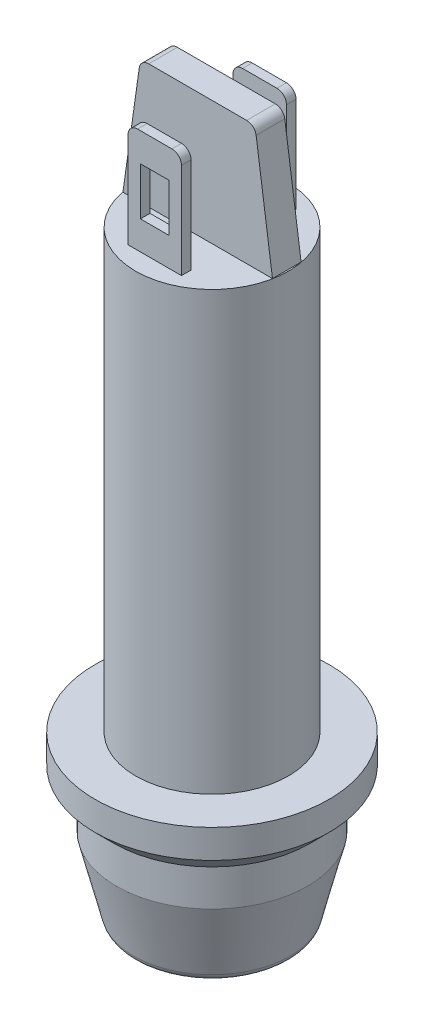
ISO-10303-21;
HEADER;
FILE_DESCRIPTION(('STEP AP214'),'2;1');
FILE_NAME('part.step','',(''),(''),'','','');
FILE_SCHEMA(('AUTOMOTIVE_DESIGN { 1 0 10303 214 1 1 1 1 }'));
ENDSEC;
DATA;
#1=APPLICATION_CONTEXT('core data for automotive mechanical design processes');
#2=APPLICATION_PROTOCOL_DEFINITION('international standard','automotive_design',2000,#1);
#3=PRODUCT_CONTEXT('',#1,'mechanical');
#4=PRODUCT('Part','Part','',(#3));
#5=PRODUCT_RELATED_PRODUCT_CATEGORY('part','',(#4));
#6=PRODUCT_DEFINITION_FORMATION('','',#4);
#7=PRODUCT_DEFINITION_CONTEXT('part definition',#1,'design');
#8=PRODUCT_DEFINITION('design','',#6,#7);
#9=PRODUCT_DEFINITION_SHAPE('','',#8);
#10=(LENGTH_UNIT() NAMED_UNIT(*) SI_UNIT(.MILLI.,.METRE.));
#11=(NAMED_UNIT(*) PLANE_ANGLE_UNIT() SI_UNIT($,.RADIAN.));
#12=(NAMED_UNIT(*) SI_UNIT($,.STERADIAN.) SOLID_ANGLE_UNIT());
#13=UNCERTAINTY_MEASURE_WITH_UNIT(LENGTH_MEASURE(1.E-05),#10,'distance_accuracy_value','');
#14=(GEOMETRIC_REPRESENTATION_CONTEXT(3) GLOBAL_UNCERTAINTY_ASSIGNED_CONTEXT((#13)) GLOBAL_UNIT_ASSIGNED_CONTEXT((#10,
#11,#12)) REPRESENTATION_CONTEXT('',''));
#15=CARTESIAN_POINT('',(0.,0.,0.));
#16=DIRECTION('',(0.,0.,1.));
#17=DIRECTION('',(1.,0.,0.));
#18=AXIS2_PLACEMENT_3D('',#15,#16,#17);
#19=CARTESIAN_POINT('',(0.,-31.4,0.));
#20=DIRECTION('',(0.,1.,0.));
#21=DIRECTION('',(0.,0.,1.));
#22=AXIS2_PLACEMENT_3D('',#19,#20,#21);
#23=PLANE('',#22);
#24=CARTESIAN_POINT('',(0.,-31.4,0.));
#25=DIRECTION('',(0.,1.,0.));
#26=DIRECTION('',(0.,0.,1.));
#27=AXIS2_PLACEMENT_3D('',#24,#25,#26);
#28=CIRCLE('',#27,3.6096117967978);
#29=CARTESIAN_POINT('',(0.,-31.4,3.6096117967978));
#30=VERTEX_POINT('',#29);
#31=EDGE_CURVE('E394',#30,#30,#28,.T.);
#32=ORIENTED_EDGE('',*,*,#31,.F.);
#33=EDGE_LOOP('',(#32));
#34=FACE_BOUND('',#33,.T.);
#35=ADVANCED_FACE('F16',(#34),#23,.F.);
#36=CARTESIAN_POINT('',(0.,-30.9,0.));
#37=DIRECTION('',(0.,1.,0.));
#38=DIRECTION('',(0.,0.,1.));
#39=AXIS2_PLACEMENT_3D('',#36,#37,#38);
#40=TOROIDAL_SURFACE('',#39,3.6096117967978,0.5);
#41=CARTESIAN_POINT('',(0.,-31.0212678125481,0.));
#42=DIRECTION('',(0.,1.,0.));
#43=DIRECTION('',(0.,0.,1.));
#44=AXIS2_PLACEMENT_3D('',#41,#42,#43);
#45=CIRCLE('',#44,4.09468304685845);
#46=CARTESIAN_POINT('',(0.,-31.0212678125481,4.09468304685845));
#47=VERTEX_POINT('',#46);
#48=EDGE_CURVE('E391',#47,#47,#45,.T.);
#49=ORIENTED_EDGE('',*,*,#48,.F.);
#50=EDGE_LOOP('',(#49));
#51=FACE_BOUND('',#50,.T.);
#52=ORIENTED_EDGE('',*,*,#31,.T.);
#53=EDGE_LOOP('',(#52));
#54=FACE_BOUND('',#53,.T.);
#55=ADVANCED_FACE('F399',(#51,#54),#40,.T.);
#56=CARTESIAN_POINT('',(0.,-27.4000000001706,0.));
#57=DIRECTION('',(0.,1.,0.));
#58=DIRECTION('',(0.,0.,1.));
#59=AXIS2_PLACEMENT_3D('',#56,#57,#58);
#60=CONICAL_SURFACE('',#59,4.99999999995282,0.244978663126864);
#61=ORIENTED_EDGE('',*,*,#48,.T.);
#62=EDGE_LOOP('',(#61));
#63=FACE_BOUND('',#62,.T.);
#64=CARTESIAN_POINT('',(0.,-27.4,0.));
#65=DIRECTION('',(0.,1.,0.));
#66=DIRECTION('',(0.,0.,1.));
#67=AXIS2_PLACEMENT_3D('',#64,#65,#66);
#68=CIRCLE('',#67,5.);
#69=CARTESIAN_POINT('',(0.,-27.4,5.));
#70=VERTEX_POINT('',#69);
#71=EDGE_CURVE('E173',#70,#70,#68,.T.);
#72=ORIENTED_EDGE('',*,*,#71,.F.);
#73=EDGE_LOOP('',(#72));
#74=FACE_BOUND('',#73,.T.);
#75=ADVANCED_FACE('F403',(#63,#74),#60,.T.);
#76=CARTESIAN_POINT('',(0.,-27.4,0.));
#77=DIRECTION('',(0.,1.,0.));
#78=DIRECTION('',(0.,0.,1.));
#79=AXIS2_PLACEMENT_3D('',#76,#77,#78);
#80=CYLINDRICAL_SURFACE('',#79,5.);
#81=ORIENTED_EDGE('',*,*,#71,.T.);
#82=EDGE_LOOP('',(#81));
#83=FACE_BOUND('',#82,.T.);
#84=CARTESIAN_POINT('',(0.,-25.4,0.));
#85=DIRECTION('',(0.,1.,0.));
#86=DIRECTION('',(0.,0.,1.));
#87=AXIS2_PLACEMENT_3D('',#84,#85,#86);
#88=CIRCLE('',#87,5.);
#89=CARTESIAN_POINT('',(0.,-25.4,5.));
#90=VERTEX_POINT('',#89);
#91=EDGE_CURVE('E383',#90,#90,#88,.T.);
#92=ORIENTED_EDGE('',*,*,#91,.F.);
#93=EDGE_LOOP('',(#92));
#94=FACE_BOUND('',#93,.T.);
#95=ADVANCED_FACE('F681',(#83,#94),#80,.T.);
#96=CARTESIAN_POINT('',(2.5655887839745,6.,0.));
#97=DIRECTION('',(0.,0.,1.));
#98=DIRECTION('',(1.,0.,0.));
#99=AXIS2_PLACEMENT_3D('',#96,#97,#98);
#100=CYLINDRICAL_SURFACE('',#99,0.5);
#101=CARTESIAN_POINT('',(2.5655887839745,6.,-0.75));
#102=DIRECTION('',(0.,0.,1.));
#103=DIRECTION('',(1.,0.,0.));
#104=AXIS2_PLACEMENT_3D('',#101,#102,#103);
#105=CIRCLE('',#104,0.5);
#106=CARTESIAN_POINT('',(3.06068593455187,6.06984848953383,-0.75));
#107=VERTEX_POINT('',#106);
#108=CARTESIAN_POINT('',(2.5655887839745,6.5,-0.75));
#109=VERTEX_POINT('',#108);
#110=EDGE_CURVE('E172',#107,#109,#105,.T.);
#111=ORIENTED_EDGE('',*,*,#110,.T.);
#112=DIRECTION('',(0.,0.,1.));
#113=VECTOR('',#112,1.);
#114=CARTESIAN_POINT('',(2.5655887839745,6.5,0.));
#115=LINE('',#114,#113);
#116=CARTESIAN_POINT('',(2.5655887839745,6.5,0.75));
#117=VERTEX_POINT('',#116);
#118=EDGE_CURVE('E170',#117,#109,#115,.F.);
#119=ORIENTED_EDGE('',*,*,#118,.F.);
#120=CARTESIAN_POINT('',(2.5655887839745,6.,0.75));
#121=DIRECTION('',(0.,0.,1.));
#122=DIRECTION('',(1.,0.,0.));
#123=AXIS2_PLACEMENT_3D('',#120,#121,#122);
#124=CIRCLE('',#123,0.5);
#125=CARTESIAN_POINT('',(3.06068593455187,6.06984848953383,0.75));
#126=VERTEX_POINT('',#125);
#127=EDGE_CURVE('E20',#117,#126,#124,.F.);
#128=ORIENTED_EDGE('',*,*,#127,.T.);
#129=DIRECTION('',(0.,0.,1.));
#130=VECTOR('',#129,1.);
#131=CARTESIAN_POINT('',(3.06068593455187,6.06984848953383,0.75));
#132=LINE('',#131,#130);
#133=EDGE_CURVE('E167',#126,#107,#132,.F.);
#134=ORIENTED_EDGE('',*,*,#133,.T.);
#135=EDGE_LOOP('',(#111,#119,#128,#134));
#136=FACE_BOUND('',#135,.T.);
#137=ADVANCED_FACE('F166',(#136),#100,.T.);
#138=CARTESIAN_POINT('',(-2.5655887839745,6.,0.));
#139=DIRECTION('',(0.,0.,-1.));
#140=DIRECTION('',(-1.,0.,0.));
#141=AXIS2_PLACEMENT_3D('',#138,#139,#140);
#142=CYLINDRICAL_SURFACE('',#141,0.5);
#143=CARTESIAN_POINT('',(-2.5655887839745,6.,0.75));
#144=DIRECTION('',(0.,0.,-1.));
#145=DIRECTION('',(-1.,0.,0.));
#146=AXIS2_PLACEMENT_3D('',#143,#144,#145);
#147=CIRCLE('',#146,0.5);
#148=CARTESIAN_POINT('',(-3.06068593455187,6.06984848953383,0.75));
#149=VERTEX_POINT('',#148);
#150=CARTESIAN_POINT('',(-2.5655887839745,6.5,0.75));
#151=VERTEX_POINT('',#150);
#152=EDGE_CURVE('E455',#149,#151,#147,.T.);
#153=ORIENTED_EDGE('',*,*,#152,.T.);
#154=DIRECTION('',(0.,0.,1.));
#155=VECTOR('',#154,1.);
#156=CARTESIAN_POINT('',(-2.5655887839745,6.5,0.));
#157=LINE('',#156,#155);
#158=CARTESIAN_POINT('',(-2.5655887839745,6.5,-0.75));
#159=VERTEX_POINT('',#158);
#160=EDGE_CURVE('E309',#159,#151,#157,.T.);
#161=ORIENTED_EDGE('',*,*,#160,.F.);
#162=CARTESIAN_POINT('',(-2.5655887839745,6.,-0.75));
#163=DIRECTION('',(0.,0.,-1.));
#164=DIRECTION('',(-1.,0.,0.));
#165=AXIS2_PLACEMENT_3D('',#162,#163,#164);
#166=CIRCLE('',#165,0.5);
#167=CARTESIAN_POINT('',(-3.06068593455187,6.06984848953383,-0.75));
#168=VERTEX_POINT('',#167);
#169=EDGE_CURVE('E458',#159,#168,#166,.F.);
#170=ORIENTED_EDGE('',*,*,#169,.T.);
#171=DIRECTION('',(0.,0.,1.));
#172=VECTOR('',#171,1.);
#173=CARTESIAN_POINT('',(-3.06068593455187,6.06984848953383,-0.75));
#174=LINE('',#173,#172);
#175=EDGE_CURVE('E322',#168,#149,#174,.T.);
#176=ORIENTED_EDGE('',*,*,#175,.T.);
#177=EDGE_LOOP('',(#153,#161,#170,#176));
#178=FACE_BOUND('',#177,.T.);
#179=ADVANCED_FACE('F670',(#178),#142,.T.);
#180=CARTESIAN_POINT('',(0.,-25.4,0.));
#181=DIRECTION('',(0.,-1.,0.));
#182=DIRECTION('',(0.,0.,-1.));
#183=AXIS2_PLACEMENT_3D('',#180,#181,#182);
#184=PLANE('',#183);
#185=ORIENTED_EDGE('',*,*,#91,.T.);
#186=EDGE_LOOP('',(#185));
#187=FACE_BOUND('',#186,.T.);
#188=CARTESIAN_POINT('',(0.,-25.4000000000474,0.));
#189=DIRECTION('',(0.,1.,0.));
#190=DIRECTION('',(0.,0.,1.));
#191=AXIS2_PLACEMENT_3D('',#188,#189,#190);
#192=CIRCLE('',#191,5.12499999996407);
#193=CARTESIAN_POINT('',(0.,-25.4000000000474,5.12499999996407));
#194=VERTEX_POINT('',#193);
#195=EDGE_CURVE('E266',#194,#194,#192,.T.);
#196=ORIENTED_EDGE('',*,*,#195,.F.);
#197=EDGE_LOOP('',(#196));
#198=FACE_BOUND('',#197,.T.);
#199=ADVANCED_FACE('F672',(#187,#198),#184,.T.);
#200=CARTESIAN_POINT('',(0.,5.5,0.));
#201=DIRECTION('',(0.,-1.,0.));
#202=DIRECTION('',(1.,0.,0.));
#203=AXIS2_PLACEMENT_3D('',#200,#201,#202);
#204=PLANE('',#203);
#205=DIRECTION('',(0.,0.,-1.));
#206=VECTOR('',#205,1.);
#207=CARTESIAN_POINT('',(0.9,5.5,2.5));
#208=LINE('',#207,#206);
#209=CARTESIAN_POINT('',(0.9,5.5,2.5));
#210=VERTEX_POINT('',#209);
#211=CARTESIAN_POINT('',(0.9,5.5,3.));
#212=VERTEX_POINT('',#211);
#213=EDGE_CURVE('E377',#210,#212,#208,.F.);
#214=ORIENTED_EDGE('',*,*,#213,.F.);
#215=DIRECTION('',(-1.,0.,0.));
#216=VECTOR('',#215,1.);
#217=CARTESIAN_POINT('',(-1.4,5.5,2.5));
#218=LINE('',#217,#216);
#219=CARTESIAN_POINT('',(-0.9,5.5,2.5));
#220=VERTEX_POINT('',#219);
#221=EDGE_CURVE('E233',#220,#210,#218,.F.);
#222=ORIENTED_EDGE('',*,*,#221,.F.);
#223=DIRECTION('',(0.,0.,1.));
#224=VECTOR('',#223,1.);
#225=CARTESIAN_POINT('',(-0.9,5.5,3.));
#226=LINE('',#225,#224);
#227=CARTESIAN_POINT('',(-0.9,5.5,3.));
#228=VERTEX_POINT('',#227);
#229=EDGE_CURVE('E357',#228,#220,#226,.F.);
#230=ORIENTED_EDGE('',*,*,#229,.F.);
#231=DIRECTION('',(1.,0.,0.));
#232=VECTOR('',#231,1.);
#233=CARTESIAN_POINT('',(1.4,5.5,3.));
#234=LINE('',#233,#232);
#235=EDGE_CURVE('E257',#212,#228,#234,.F.);
#236=ORIENTED_EDGE('',*,*,#235,.F.);
#237=EDGE_LOOP('',(#214,#222,#230,#236));
#238=FACE_BOUND('',#237,.T.);
#239=ADVANCED_FACE('F678',(#238),#204,.F.);
#240=CARTESIAN_POINT('',(0.9,5.,2.5));
#241=DIRECTION('',(0.,0.,-1.));
#242=DIRECTION('',(-1.,0.,0.));
#243=AXIS2_PLACEMENT_3D('',#240,#241,#242);
#244=CYLINDRICAL_SURFACE('',#243,0.5);
#245=CARTESIAN_POINT('',(0.9,5.,3.));
#246=DIRECTION('',(0.,0.,-1.));
#247=DIRECTION('',(-1.,0.,0.));
#248=AXIS2_PLACEMENT_3D('',#245,#246,#247);
#249=CIRCLE('',#248,0.5);
#250=CARTESIAN_POINT('',(1.4,5.,3.));
#251=VERTEX_POINT('',#250);
#252=EDGE_CURVE('E261',#251,#212,#249,.F.);
#253=ORIENTED_EDGE('',*,*,#252,.F.);
#254=DIRECTION('',(0.,0.,-1.));
#255=VECTOR('',#254,1.);
#256=CARTESIAN_POINT('',(1.4,5.,2.5));
#257=LINE('',#256,#255);
#258=CARTESIAN_POINT('',(1.4,5.,2.5));
#259=VERTEX_POINT('',#258);
#260=EDGE_CURVE('E374',#259,#251,#257,.F.);
#261=ORIENTED_EDGE('',*,*,#260,.F.);
#262=CARTESIAN_POINT('',(0.9,5.,2.5));
#263=DIRECTION('',(0.,0.,-1.));
#264=DIRECTION('',(-1.,0.,0.));
#265=AXIS2_PLACEMENT_3D('',#262,#263,#264);
#266=CIRCLE('',#265,0.5);
#267=EDGE_CURVE('E230',#210,#259,#266,.T.);
#268=ORIENTED_EDGE('',*,*,#267,.F.);
#269=ORIENTED_EDGE('',*,*,#213,.T.);
#270=EDGE_LOOP('',(#253,#261,#268,#269));
#271=FACE_BOUND('',#270,.T.);
#272=ADVANCED_FACE('F776',(#271),#244,.T.);
#273=CARTESIAN_POINT('',(1.4,5.5,2.5));
#274=DIRECTION('',(1.,0.,0.));
#275=DIRECTION('',(0.,0.,-1.));
#276=AXIS2_PLACEMENT_3D('',#273,#274,#275);
#277=PLANE('',#276);
#278=DIRECTION('',(0.,1.,0.));
#279=VECTOR('',#278,1.);
#280=CARTESIAN_POINT('',(1.4,5.5,3.));
#281=LINE('',#280,#279);
#282=CARTESIAN_POINT('',(1.4,0.,3.));
#283=VERTEX_POINT('',#282);
#284=EDGE_CURVE('E262',#283,#251,#281,.T.);
#285=ORIENTED_EDGE('',*,*,#284,.F.);
#286=DIRECTION('',(0.,0.,-1.));
#287=VECTOR('',#286,1.);
#288=CARTESIAN_POINT('',(1.4,0.,2.5));
#289=LINE('',#288,#287);
#290=CARTESIAN_POINT('',(1.4,0.,2.5));
#291=VERTEX_POINT('',#290);
#292=EDGE_CURVE('E366',#283,#291,#289,.T.);
#293=ORIENTED_EDGE('',*,*,#292,.T.);
#294=DIRECTION('',(0.,1.,0.));
#295=VECTOR('',#294,1.);
#296=CARTESIAN_POINT('',(1.4,5.5,2.5));
#297=LINE('',#296,#295);
#298=EDGE_CURVE('E225',#259,#291,#297,.F.);
#299=ORIENTED_EDGE('',*,*,#298,.F.);
#300=ORIENTED_EDGE('',*,*,#260,.T.);
#301=EDGE_LOOP('',(#285,#293,#299,#300));
#302=FACE_BOUND('',#301,.T.);
#303=ADVANCED_FACE('F785',(#302),#277,.T.);
#304=CARTESIAN_POINT('',(-1.4,5.5,3.));
#305=DIRECTION('',(-1.,0.,0.));
#306=DIRECTION('',(0.,0.,1.));
#307=AXIS2_PLACEMENT_3D('',#304,#305,#306);
#308=PLANE('',#307);
#309=DIRECTION('',(0.,1.,0.));
#310=VECTOR('',#309,1.);
#311=CARTESIAN_POINT('',(-1.4,5.5,2.5));
#312=LINE('',#311,#310);
#313=CARTESIAN_POINT('',(-1.4,0.,2.5));
#314=VERTEX_POINT('',#313);
#315=CARTESIAN_POINT('',(-1.4,5.,2.5));
#316=VERTEX_POINT('',#315);
#317=EDGE_CURVE('E221',#314,#316,#312,.T.);
#318=ORIENTED_EDGE('',*,*,#317,.F.);
#319=DIRECTION('',(0.,0.,1.));
#320=VECTOR('',#319,1.);
#321=CARTESIAN_POINT('',(-1.4,0.,3.));
#322=LINE('',#321,#320);
#323=CARTESIAN_POINT('',(-1.4,0.,3.));
#324=VERTEX_POINT('',#323);
#325=EDGE_CURVE('E361',#314,#324,#322,.T.);
#326=ORIENTED_EDGE('',*,*,#325,.T.);
#327=DIRECTION('',(0.,1.,0.));
#328=VECTOR('',#327,1.);
#329=CARTESIAN_POINT('',(-1.4,5.5,3.));
#330=LINE('',#329,#328);
#331=CARTESIAN_POINT('',(-1.4,5.,3.));
#332=VERTEX_POINT('',#331);
#333=EDGE_CURVE('E250',#332,#324,#330,.F.);
#334=ORIENTED_EDGE('',*,*,#333,.F.);
#335=DIRECTION('',(0.,0.,1.));
#336=VECTOR('',#335,1.);
#337=CARTESIAN_POINT('',(-1.4,5.,3.));
#338=LINE('',#337,#336);
#339=EDGE_CURVE('E356',#316,#332,#338,.T.);
#340=ORIENTED_EDGE('',*,*,#339,.F.);
#341=EDGE_LOOP('',(#318,#326,#334,#340));
#342=FACE_BOUND('',#341,.T.);
#343=ADVANCED_FACE('F795',(#342),#308,.T.);
#344=CARTESIAN_POINT('',(-0.9,5.,3.));
#345=DIRECTION('',(0.,0.,1.));
#346=DIRECTION('',(1.,0.,0.));
#347=AXIS2_PLACEMENT_3D('',#344,#345,#346);
#348=CYLINDRICAL_SURFACE('',#347,0.5);
#349=CARTESIAN_POINT('',(-0.9,5.,2.5));
#350=DIRECTION('',(0.,0.,1.));
#351=DIRECTION('',(1.,0.,0.));
#352=AXIS2_PLACEMENT_3D('',#349,#350,#351);
#353=CIRCLE('',#352,0.5);
#354=EDGE_CURVE('E220',#316,#220,#353,.F.);
#355=ORIENTED_EDGE('',*,*,#354,.F.);
#356=ORIENTED_EDGE('',*,*,#339,.T.);
#357=CARTESIAN_POINT('',(-0.9,5.,3.));
#358=DIRECTION('',(0.,0.,1.));
#359=DIRECTION('',(1.,0.,0.));
#360=AXIS2_PLACEMENT_3D('',#357,#358,#359);
#361=CIRCLE('',#360,0.5);
#362=EDGE_CURVE('E254',#228,#332,#361,.T.);
#363=ORIENTED_EDGE('',*,*,#362,.F.);
#364=ORIENTED_EDGE('',*,*,#229,.T.);
#365=EDGE_LOOP('',(#355,#356,#363,#364));
#366=FACE_BOUND('',#365,.T.);
#367=ADVANCED_FACE('F805',(#366),#348,.T.);
#368=CARTESIAN_POINT('',(-0.75,1.5,1.94581997982342));
#369=DIRECTION('',(0.,-1.,0.));
#370=DIRECTION('',(1.,0.,0.));
#371=AXIS2_PLACEMENT_3D('',#368,#369,#370);
#372=PLANE('',#371);
#373=DIRECTION('',(0.,0.,1.));
#374=VECTOR('',#373,1.);
#375=CARTESIAN_POINT('',(-0.749999999999999,1.5,1.94581997982342));
#376=LINE('',#375,#374);
#377=CARTESIAN_POINT('',(-0.75,1.5,2.5));
#378=VERTEX_POINT('',#377);
#379=CARTESIAN_POINT('',(-0.75,1.5,3.));
#380=VERTEX_POINT('',#379);
#381=EDGE_CURVE('E346',#378,#380,#376,.T.);
#382=ORIENTED_EDGE('',*,*,#381,.T.);
#383=DIRECTION('',(1.,0.,0.));
#384=VECTOR('',#383,1.);
#385=CARTESIAN_POINT('',(1.4,1.5,3.));
#386=LINE('',#385,#384);
#387=CARTESIAN_POINT('',(0.75,1.5,3.));
#388=VERTEX_POINT('',#387);
#389=EDGE_CURVE('E246',#388,#380,#386,.F.);
#390=ORIENTED_EDGE('',*,*,#389,.F.);
#391=DIRECTION('',(0.,0.,1.));
#392=VECTOR('',#391,1.);
#393=CARTESIAN_POINT('',(0.75,1.5,1.94581997982342));
#394=LINE('',#393,#392);
#395=CARTESIAN_POINT('',(0.75,1.5,2.5));
#396=VERTEX_POINT('',#395);
#397=EDGE_CURVE('E353',#388,#396,#394,.F.);
#398=ORIENTED_EDGE('',*,*,#397,.T.);
#399=DIRECTION('',(-1.,0.,0.));
#400=VECTOR('',#399,1.);
#401=CARTESIAN_POINT('',(-1.4,1.5,2.5));
#402=LINE('',#401,#400);
#403=EDGE_CURVE('E216',#378,#396,#402,.F.);
#404=ORIENTED_EDGE('',*,*,#403,.F.);
#405=EDGE_LOOP('',(#382,#390,#398,#404));
#406=FACE_BOUND('',#405,.T.);
#407=ADVANCED_FACE('F564',(#406),#372,.F.);
#408=CARTESIAN_POINT('',(0.75,1.5,1.94581997982342));
#409=DIRECTION('',(1.,0.,0.));
#410=DIRECTION('',(0.,1.,0.));
#411=AXIS2_PLACEMENT_3D('',#408,#409,#410);
#412=PLANE('',#411);
#413=ORIENTED_EDGE('',*,*,#397,.F.);
#414=DIRECTION('',(0.,1.,0.));
#415=VECTOR('',#414,1.);
#416=CARTESIAN_POINT('',(0.75,5.5,3.));
#417=LINE('',#416,#415);
#418=CARTESIAN_POINT('',(0.75,4.,3.));
#419=VERTEX_POINT('',#418);
#420=EDGE_CURVE('E236',#419,#388,#417,.F.);
#421=ORIENTED_EDGE('',*,*,#420,.F.);
#422=DIRECTION('',(0.,0.,1.));
#423=VECTOR('',#422,1.);
#424=CARTESIAN_POINT('',(0.75,4.,1.94581997982342));
#425=LINE('',#424,#423);
#426=CARTESIAN_POINT('',(0.75,4.,2.5));
#427=VERTEX_POINT('',#426);
#428=EDGE_CURVE('E350',#419,#427,#425,.F.);
#429=ORIENTED_EDGE('',*,*,#428,.T.);
#430=DIRECTION('',(0.,1.,0.));
#431=VECTOR('',#430,1.);
#432=CARTESIAN_POINT('',(0.75,5.5,2.5));
#433=LINE('',#432,#431);
#434=EDGE_CURVE('E213',#396,#427,#433,.T.);
#435=ORIENTED_EDGE('',*,*,#434,.F.);
#436=EDGE_LOOP('',(#413,#421,#429,#435));
#437=FACE_BOUND('',#436,.T.);
#438=ADVANCED_FACE('F574',(#437),#412,.F.);
#439=CARTESIAN_POINT('',(0.,4.,1.94581997982342));
#440=DIRECTION('',(0.,1.,0.));
#441=DIRECTION('',(0.,0.,1.));
#442=AXIS2_PLACEMENT_3D('',#439,#440,#441);
#443=PLANE('',#442);
#444=ORIENTED_EDGE('',*,*,#428,.F.);
#445=DIRECTION('',(1.,0.,0.));
#446=VECTOR('',#445,1.);
#447=CARTESIAN_POINT('',(1.4,4.,3.));
#448=LINE('',#447,#446);
#449=CARTESIAN_POINT('',(-0.75,4.,3.));
#450=VERTEX_POINT('',#449);
#451=EDGE_CURVE('E239',#450,#419,#448,.T.);
#452=ORIENTED_EDGE('',*,*,#451,.F.);
#453=DIRECTION('',(0.,0.,1.));
#454=VECTOR('',#453,1.);
#455=CARTESIAN_POINT('',(-0.75,4.,1.94581997982342));
#456=LINE('',#455,#454);
#457=CARTESIAN_POINT('',(-0.75,4.,2.5));
#458=VERTEX_POINT('',#457);
#459=EDGE_CURVE('E336',#450,#458,#456,.F.);
#460=ORIENTED_EDGE('',*,*,#459,.T.);
#461=DIRECTION('',(-1.,0.,0.));
#462=VECTOR('',#461,1.);
#463=CARTESIAN_POINT('',(-1.4,4.,2.5));
#464=LINE('',#463,#462);
#465=EDGE_CURVE('E210',#427,#458,#464,.T.);
#466=ORIENTED_EDGE('',*,*,#465,.F.);
#467=EDGE_LOOP('',(#444,#452,#460,#466));
#468=FACE_BOUND('',#467,.T.);
#469=ADVANCED_FACE('F581',(#468),#443,.F.);
#470=CARTESIAN_POINT('',(-0.75,4.,1.94581997982342));
#471=DIRECTION('',(-1.,0.,0.));
#472=DIRECTION('',(0.,-1.,0.));
#473=AXIS2_PLACEMENT_3D('',#470,#471,#472);
#474=PLANE('',#473);
#475=ORIENTED_EDGE('',*,*,#459,.F.);
#476=DIRECTION('',(0.,1.,0.));
#477=VECTOR('',#476,1.);
#478=CARTESIAN_POINT('',(-0.75,5.5,3.));
#479=LINE('',#478,#477);
#480=EDGE_CURVE('E242',#380,#450,#479,.T.);
#481=ORIENTED_EDGE('',*,*,#480,.F.);
#482=ORIENTED_EDGE('',*,*,#381,.F.);
#483=DIRECTION('',(0.,1.,0.));
#484=VECTOR('',#483,1.);
#485=CARTESIAN_POINT('',(-0.75,5.5,2.5));
#486=LINE('',#485,#484);
#487=EDGE_CURVE('E204',#458,#378,#486,.F.);
#488=ORIENTED_EDGE('',*,*,#487,.F.);
#489=EDGE_LOOP('',(#475,#481,#482,#488));
#490=FACE_BOUND('',#489,.T.);
#491=ADVANCED_FACE('F567',(#490),#474,.F.);
#492=CARTESIAN_POINT('',(-3.,6.5,-0.75));
#493=DIRECTION('',(0.990194301154763,-0.139696979067663,0.));
#494=DIRECTION('',(0.139696979067663,0.990194301154763,0.));
#495=AXIS2_PLACEMENT_3D('',#492,#493,#494);
#496=PLANE('',#495);
#497=ORIENTED_EDGE('',*,*,#175,.F.);
#498=DIRECTION('',(-0.139696979067664,-0.990194301154762,0.));
#499=VECTOR('',#498,1.);
#500=CARTESIAN_POINT('',(-3.06068593455187,6.06984848953383,-0.75));
#501=LINE('',#500,#499);
#502=CARTESIAN_POINT('',(-3.91702240952192,0.,-0.75));
#503=VERTEX_POINT('',#502);
#504=EDGE_CURVE('E187',#168,#503,#501,.T.);
#505=ORIENTED_EDGE('',*,*,#504,.T.);
#506=DIRECTION('',(0.,0.,1.));
#507=VECTOR('',#506,1.);
#508=CARTESIAN_POINT('',(-3.91702240952192,0.,-0.75));
#509=LINE('',#508,#507);
#510=CARTESIAN_POINT('',(-3.91702240952192,0.,0.750000000000001));
#511=VERTEX_POINT('',#510);
#512=EDGE_CURVE('E333',#511,#503,#509,.F.);
#513=ORIENTED_EDGE('',*,*,#512,.F.);
#514=DIRECTION('',(0.139696979067664,0.990194301154762,0.));
#515=VECTOR('',#514,1.);
#516=CARTESIAN_POINT('',(-3.91702240952192,0.,0.75));
#517=LINE('',#516,#515);
#518=EDGE_CURVE('E194',#511,#149,#517,.T.);
#519=ORIENTED_EDGE('',*,*,#518,.T.);
#520=EDGE_LOOP('',(#497,#505,#513,#519));
#521=FACE_BOUND('',#520,.T.);
#522=ADVANCED_FACE('F589',(#521),#496,.F.);
#523=CARTESIAN_POINT('',(3.,6.5,0.75));
#524=DIRECTION('',(-0.990194301154763,-0.139696979067663,0.));
#525=DIRECTION('',(0.139696979067663,-0.990194301154763,0.));
#526=AXIS2_PLACEMENT_3D('',#523,#524,#525);
#527=PLANE('',#526);
#528=ORIENTED_EDGE('',*,*,#133,.F.);
#529=DIRECTION('',(0.139696979067664,-0.990194301154763,0.));
#530=VECTOR('',#529,1.);
#531=CARTESIAN_POINT('',(3.06068593455187,6.06984848953383,0.75));
#532=LINE('',#531,#530);
#533=CARTESIAN_POINT('',(3.91702240952192,0.,0.75));
#534=VERTEX_POINT('',#533);
#535=EDGE_CURVE('E177',#126,#534,#532,.T.);
#536=ORIENTED_EDGE('',*,*,#535,.T.);
#537=DIRECTION('',(0.,0.,1.));
#538=VECTOR('',#537,1.);
#539=CARTESIAN_POINT('',(3.91702240952192,0.,0.75));
#540=LINE('',#539,#538);
#541=CARTESIAN_POINT('',(3.91702240952192,0.,-0.75));
#542=VERTEX_POINT('',#541);
#543=EDGE_CURVE('E181',#542,#534,#540,.T.);
#544=ORIENTED_EDGE('',*,*,#543,.F.);
#545=DIRECTION('',(-0.139696979067664,0.990194301154763,0.));
#546=VECTOR('',#545,1.);
#547=CARTESIAN_POINT('',(3.91702240952192,0.,-0.75));
#548=LINE('',#547,#546);
#549=EDGE_CURVE('E180',#542,#107,#548,.T.);
#550=ORIENTED_EDGE('',*,*,#549,.T.);
#551=EDGE_LOOP('',(#528,#536,#544,#550));
#552=FACE_BOUND('',#551,.T.);
#553=ADVANCED_FACE('F176',(#552),#527,.F.);
#554=CARTESIAN_POINT('',(0.,6.5,0.));
#555=DIRECTION('',(0.,1.,0.));
#556=DIRECTION('',(0.,0.,1.));
#557=AXIS2_PLACEMENT_3D('',#554,#555,#556);
#558=PLANE('',#557);
#559=DIRECTION('',(1.,0.,0.));
#560=VECTOR('',#559,1.);
#561=CARTESIAN_POINT('',(3.,6.5,-0.75));
#562=LINE('',#561,#560);
#563=EDGE_CURVE('E439',#109,#159,#562,.F.);
#564=ORIENTED_EDGE('',*,*,#563,.T.);
#565=ORIENTED_EDGE('',*,*,#160,.T.);
#566=DIRECTION('',(-1.,0.,0.));
#567=VECTOR('',#566,1.);
#568=CARTESIAN_POINT('',(-3.,6.5,0.75));
#569=LINE('',#568,#567);
#570=EDGE_CURVE('E188',#151,#117,#569,.F.);
#571=ORIENTED_EDGE('',*,*,#570,.T.);
#572=ORIENTED_EDGE('',*,*,#118,.T.);
#573=EDGE_LOOP('',(#564,#565,#571,#572));
#574=FACE_BOUND('',#573,.T.);
#575=ADVANCED_FACE('F463',(#574),#558,.T.);
#576=CARTESIAN_POINT('',(-1.4,5.5,-3.));
#577=DIRECTION('',(1.,0.,0.));
#578=DIRECTION('',(0.,0.,-1.));
#579=AXIS2_PLACEMENT_3D('',#576,#577,#578);
#580=PLANE('',#579);
#581=DIRECTION('',(0.,0.,-1.));
#582=VECTOR('',#581,1.);
#583=CARTESIAN_POINT('',(-1.4,5.,0.));
#584=LINE('',#583,#582);
#585=CARTESIAN_POINT('',(-1.4,5.,-3.));
#586=VERTEX_POINT('',#585);
#587=CARTESIAN_POINT('',(-1.4,5.,-2.5));
#588=VERTEX_POINT('',#587);
#589=EDGE_CURVE('E304',#586,#588,#584,.F.);
#590=ORIENTED_EDGE('',*,*,#589,.F.);
#591=DIRECTION('',(0.,1.,0.));
#592=VECTOR('',#591,1.);
#593=CARTESIAN_POINT('',(-1.4,5.5,-3.));
#594=LINE('',#593,#592);
#595=CARTESIAN_POINT('',(-1.4,0.,-3.));
#596=VERTEX_POINT('',#595);
#597=EDGE_CURVE('E438',#586,#596,#594,.F.);
#598=ORIENTED_EDGE('',*,*,#597,.T.);
#599=DIRECTION('',(0.,0.,-1.));
#600=VECTOR('',#599,1.);
#601=CARTESIAN_POINT('',(-1.4,0.,-3.));
#602=LINE('',#601,#600);
#603=CARTESIAN_POINT('',(-1.4,0.,-2.5));
#604=VERTEX_POINT('',#603);
#605=EDGE_CURVE('E307',#604,#596,#602,.T.);
#606=ORIENTED_EDGE('',*,*,#605,.F.);
#607=DIRECTION('',(0.,1.,0.));
#608=VECTOR('',#607,1.);
#609=CARTESIAN_POINT('',(-1.4,5.5,-2.5));
#610=LINE('',#609,#608);
#611=EDGE_CURVE('E429',#604,#588,#610,.T.);
#612=ORIENTED_EDGE('',*,*,#611,.T.);
#613=EDGE_LOOP('',(#590,#598,#606,#612));
#614=FACE_BOUND('',#613,.T.);
#615=ADVANCED_FACE('F652',(#614),#580,.F.);
#616=CARTESIAN_POINT('',(-0.9,5.,0.));
#617=DIRECTION('',(0.,0.,-1.));
#618=DIRECTION('',(-1.,0.,0.));
#619=AXIS2_PLACEMENT_3D('',#616,#617,#618);
#620=CYLINDRICAL_SURFACE('',#619,0.5);
#621=CARTESIAN_POINT('',(-0.9,5.,-2.5));
#622=DIRECTION('',(0.,0.,-1.));
#623=DIRECTION('',(-1.,0.,0.));
#624=AXIS2_PLACEMENT_3D('',#621,#622,#623);
#625=CIRCLE('',#624,0.5);
#626=CARTESIAN_POINT('',(-0.9,5.5,-2.5));
#627=VERTEX_POINT('',#626);
#628=EDGE_CURVE('E427',#588,#627,#625,.T.);
#629=ORIENTED_EDGE('',*,*,#628,.T.);
#630=DIRECTION('',(0.,0.,1.));
#631=VECTOR('',#630,1.);
#632=CARTESIAN_POINT('',(-0.9,5.5,0.));
#633=LINE('',#632,#631);
#634=CARTESIAN_POINT('',(-0.9,5.5,-3.));
#635=VERTEX_POINT('',#634);
#636=EDGE_CURVE('E301',#635,#627,#633,.T.);
#637=ORIENTED_EDGE('',*,*,#636,.F.);
#638=CARTESIAN_POINT('',(-0.9,5.,-3.));
#639=DIRECTION('',(0.,0.,-1.));
#640=DIRECTION('',(-1.,0.,0.));
#641=AXIS2_PLACEMENT_3D('',#638,#639,#640);
#642=CIRCLE('',#641,0.5);
#643=EDGE_CURVE('E435',#635,#586,#642,.F.);
#644=ORIENTED_EDGE('',*,*,#643,.T.);
#645=ORIENTED_EDGE('',*,*,#589,.T.);
#646=EDGE_LOOP('',(#629,#637,#644,#645));
#647=FACE_BOUND('',#646,.T.);
#648=ADVANCED_FACE('F648',(#647),#620,.T.);
#649=CARTESIAN_POINT('',(0.,5.5,0.));
#650=DIRECTION('',(0.,1.,0.));
#651=DIRECTION('',(0.,0.,1.));
#652=AXIS2_PLACEMENT_3D('',#649,#650,#651);
#653=PLANE('',#652);
#654=DIRECTION('',(1.,0.,0.));
#655=VECTOR('',#654,1.);
#656=CARTESIAN_POINT('',(1.4,5.5,-3.));
#657=LINE('',#656,#655);
#658=CARTESIAN_POINT('',(0.9,5.5,-3.));
#659=VERTEX_POINT('',#658);
#660=EDGE_CURVE('E433',#659,#635,#657,.F.);
#661=ORIENTED_EDGE('',*,*,#660,.T.);
#662=ORIENTED_EDGE('',*,*,#636,.T.);
#663=DIRECTION('',(-1.,0.,0.));
#664=VECTOR('',#663,1.);
#665=CARTESIAN_POINT('',(-1.4,5.5,-2.5));
#666=LINE('',#665,#664);
#667=CARTESIAN_POINT('',(0.9,5.5,-2.5));
#668=VERTEX_POINT('',#667);
#669=EDGE_CURVE('E426',#627,#668,#666,.F.);
#670=ORIENTED_EDGE('',*,*,#669,.T.);
#671=DIRECTION('',(0.,0.,1.));
#672=VECTOR('',#671,1.);
#673=CARTESIAN_POINT('',(0.9,5.5,0.));
#674=LINE('',#673,#672);
#675=EDGE_CURVE('E289',#659,#668,#674,.T.);
#676=ORIENTED_EDGE('',*,*,#675,.F.);
#677=EDGE_LOOP('',(#661,#662,#670,#676));
#678=FACE_BOUND('',#677,.T.);
#679=ADVANCED_FACE('F644',(#678),#653,.T.);
#680=CARTESIAN_POINT('',(0.9,5.,0.));
#681=DIRECTION('',(0.,0.,1.));
#682=DIRECTION('',(1.,0.,0.));
#683=AXIS2_PLACEMENT_3D('',#680,#681,#682);
#684=CYLINDRICAL_SURFACE('',#683,0.5);
#685=CARTESIAN_POINT('',(0.9,5.,-3.));
#686=DIRECTION('',(0.,0.,1.));
#687=DIRECTION('',(1.,0.,0.));
#688=AXIS2_PLACEMENT_3D('',#685,#686,#687);
#689=CIRCLE('',#688,0.5);
#690=CARTESIAN_POINT('',(1.4,5.,-3.));
#691=VERTEX_POINT('',#690);
#692=EDGE_CURVE('E430',#691,#659,#689,.T.);
#693=ORIENTED_EDGE('',*,*,#692,.T.);
#694=ORIENTED_EDGE('',*,*,#675,.T.);
#695=CARTESIAN_POINT('',(0.9,5.,-2.5));
#696=DIRECTION('',(0.,0.,1.));
#697=DIRECTION('',(1.,0.,0.));
#698=AXIS2_PLACEMENT_3D('',#695,#696,#697);
#699=CIRCLE('',#698,0.5);
#700=CARTESIAN_POINT('',(1.4,5.,-2.5));
#701=VERTEX_POINT('',#700);
#702=EDGE_CURVE('E423',#668,#701,#699,.F.);
#703=ORIENTED_EDGE('',*,*,#702,.T.);
#704=DIRECTION('',(0.,0.,1.));
#705=VECTOR('',#704,1.);
#706=CARTESIAN_POINT('',(1.4,5.,-2.5));
#707=LINE('',#706,#705);
#708=EDGE_CURVE('E286',#701,#691,#707,.F.);
#709=ORIENTED_EDGE('',*,*,#708,.T.);
#710=EDGE_LOOP('',(#693,#694,#703,#709));
#711=FACE_BOUND('',#710,.T.);
#712=ADVANCED_FACE('F640',(#711),#684,.T.);
#713=CARTESIAN_POINT('',(1.4,5.5,-2.5));
#714=DIRECTION('',(-1.,0.,0.));
#715=DIRECTION('',(0.,0.,1.));
#716=AXIS2_PLACEMENT_3D('',#713,#714,#715);
#717=PLANE('',#716);
#718=ORIENTED_EDGE('',*,*,#708,.F.);
#719=DIRECTION('',(0.,1.,0.));
#720=VECTOR('',#719,1.);
#721=CARTESIAN_POINT('',(1.4,5.5,-2.5));
#722=LINE('',#721,#720);
#723=CARTESIAN_POINT('',(1.4,0.,-2.5));
#724=VERTEX_POINT('',#723);
#725=EDGE_CURVE('E425',#701,#724,#722,.F.);
#726=ORIENTED_EDGE('',*,*,#725,.T.);
#727=DIRECTION('',(0.,0.,1.));
#728=VECTOR('',#727,1.);
#729=CARTESIAN_POINT('',(1.4,0.,-2.5));
#730=LINE('',#729,#728);
#731=CARTESIAN_POINT('',(1.4,0.,-3.));
#732=VERTEX_POINT('',#731);
#733=EDGE_CURVE('E35',#732,#724,#730,.T.);
#734=ORIENTED_EDGE('',*,*,#733,.F.);
#735=DIRECTION('',(0.,1.,0.));
#736=VECTOR('',#735,1.);
#737=CARTESIAN_POINT('',(1.4,5.5,-3.));
#738=LINE('',#737,#736);
#739=EDGE_CURVE('E434',#732,#691,#738,.T.);
#740=ORIENTED_EDGE('',*,*,#739,.T.);
#741=EDGE_LOOP('',(#718,#726,#734,#740));
#742=FACE_BOUND('',#741,.T.);
#743=ADVANCED_FACE('F637',(#742),#717,.F.);
#744=CARTESIAN_POINT('',(0.,4.,-1.72125476442403));
#745=DIRECTION('',(0.,1.,0.));
#746=DIRECTION('',(0.,0.,1.));
#747=AXIS2_PLACEMENT_3D('',#744,#745,#746);
#748=PLANE('',#747);
#749=DIRECTION('',(1.,0.,0.));
#750=VECTOR('',#749,1.);
#751=CARTESIAN_POINT('',(1.4,4.,-3.));
#752=LINE('',#751,#750);
#753=CARTESIAN_POINT('',(-0.75,4.,-3.));
#754=VERTEX_POINT('',#753);
#755=CARTESIAN_POINT('',(0.75,4.,-3.));
#756=VERTEX_POINT('',#755);
#757=EDGE_CURVE('E482',#754,#756,#752,.T.);
#758=ORIENTED_EDGE('',*,*,#757,.T.);
#759=DIRECTION('',(0.,0.,1.));
#760=VECTOR('',#759,1.);
#761=CARTESIAN_POINT('',(0.75,4.,-1.72125476442403));
#762=LINE('',#761,#760);
#763=CARTESIAN_POINT('',(0.75,4.,-2.5));
#764=VERTEX_POINT('',#763);
#765=EDGE_CURVE('E274',#756,#764,#762,.T.);
#766=ORIENTED_EDGE('',*,*,#765,.T.);
#767=DIRECTION('',(-1.,0.,0.));
#768=VECTOR('',#767,1.);
#769=CARTESIAN_POINT('',(-1.4,4.,-2.5));
#770=LINE('',#769,#768);
#771=CARTESIAN_POINT('',(-0.75,4.,-2.5));
#772=VERTEX_POINT('',#771);
#773=EDGE_CURVE('E501',#764,#772,#770,.T.);
#774=ORIENTED_EDGE('',*,*,#773,.T.);
#775=DIRECTION('',(0.,0.,1.));
#776=VECTOR('',#775,1.);
#777=CARTESIAN_POINT('',(-0.750000000000001,4.,-1.72125476442403));
#778=LINE('',#777,#776);
#779=EDGE_CURVE('E283',#772,#754,#778,.F.);
#780=ORIENTED_EDGE('',*,*,#779,.T.);
#781=EDGE_LOOP('',(#758,#766,#774,#780));
#782=FACE_BOUND('',#781,.T.);
#783=ADVANCED_FACE('F528',(#782),#748,.F.);
#784=CARTESIAN_POINT('',(-0.75,1.5,-1.72125476442403));
#785=DIRECTION('',(-1.,0.,0.));
#786=DIRECTION('',(0.,-1.,0.));
#787=AXIS2_PLACEMENT_3D('',#784,#785,#786);
#788=PLANE('',#787);
#789=DIRECTION('',(0.,1.,0.));
#790=VECTOR('',#789,1.);
#791=CARTESIAN_POINT('',(-0.75,5.5,-3.));
#792=LINE('',#791,#790);
#793=CARTESIAN_POINT('',(-0.75,1.5,-3.));
#794=VERTEX_POINT('',#793);
#795=EDGE_CURVE('E491',#794,#754,#792,.T.);
#796=ORIENTED_EDGE('',*,*,#795,.T.);
#797=ORIENTED_EDGE('',*,*,#779,.F.);
#798=DIRECTION('',(0.,1.,0.));
#799=VECTOR('',#798,1.);
#800=CARTESIAN_POINT('',(-0.75,5.5,-2.5));
#801=LINE('',#800,#799);
#802=CARTESIAN_POINT('',(-0.75,1.5,-2.5));
#803=VERTEX_POINT('',#802);
#804=EDGE_CURVE('E504',#772,#803,#801,.F.);
#805=ORIENTED_EDGE('',*,*,#804,.T.);
#806=DIRECTION('',(0.,0.,1.));
#807=VECTOR('',#806,1.);
#808=CARTESIAN_POINT('',(-0.75,1.5,-1.72125476442403));
#809=LINE('',#808,#807);
#810=EDGE_CURVE('E280',#803,#794,#809,.F.);
#811=ORIENTED_EDGE('',*,*,#810,.T.);
#812=EDGE_LOOP('',(#796,#797,#805,#811));
#813=FACE_BOUND('',#812,.T.);
#814=ADVANCED_FACE('F532',(#813),#788,.F.);
#815=CARTESIAN_POINT('',(0.75,1.5,-1.72125476442403));
#816=DIRECTION('',(0.,-1.,0.));
#817=DIRECTION('',(1.,0.,0.));
#818=AXIS2_PLACEMENT_3D('',#815,#816,#817);
#819=PLANE('',#818);
#820=DIRECTION('',(1.,0.,0.));
#821=VECTOR('',#820,1.);
#822=CARTESIAN_POINT('',(1.4,1.5,-3.));
#823=LINE('',#822,#821);
#824=CARTESIAN_POINT('',(0.75,1.5,-3.));
#825=VERTEX_POINT('',#824);
#826=EDGE_CURVE('E488',#825,#794,#823,.F.);
#827=ORIENTED_EDGE('',*,*,#826,.T.);
#828=ORIENTED_EDGE('',*,*,#810,.F.);
#829=DIRECTION('',(-1.,0.,0.));
#830=VECTOR('',#829,1.);
#831=CARTESIAN_POINT('',(-1.4,1.5,-2.5));
#832=LINE('',#831,#830);
#833=CARTESIAN_POINT('',(0.75,1.5,-2.5));
#834=VERTEX_POINT('',#833);
#835=EDGE_CURVE('E507',#803,#834,#832,.F.);
#836=ORIENTED_EDGE('',*,*,#835,.T.);
#837=DIRECTION('',(0.,0.,1.));
#838=VECTOR('',#837,1.);
#839=CARTESIAN_POINT('',(0.75,1.5,-1.72125476442403));
#840=LINE('',#839,#838);
#841=EDGE_CURVE('E277',#834,#825,#840,.F.);
#842=ORIENTED_EDGE('',*,*,#841,.T.);
#843=EDGE_LOOP('',(#827,#828,#836,#842));
#844=FACE_BOUND('',#843,.T.);
#845=ADVANCED_FACE('F629',(#844),#819,.F.);
#846=CARTESIAN_POINT('',(0.75,4.,-1.72125476442403));
#847=DIRECTION('',(1.,0.,0.));
#848=DIRECTION('',(0.,1.,0.));
#849=AXIS2_PLACEMENT_3D('',#846,#847,#848);
#850=PLANE('',#849);
#851=DIRECTION('',(0.,1.,0.));
#852=VECTOR('',#851,1.);
#853=CARTESIAN_POINT('',(0.75,5.5,-3.));
#854=LINE('',#853,#852);
#855=EDGE_CURVE('E485',#756,#825,#854,.F.);
#856=ORIENTED_EDGE('',*,*,#855,.T.);
#857=ORIENTED_EDGE('',*,*,#841,.F.);
#858=DIRECTION('',(0.,1.,0.));
#859=VECTOR('',#858,1.);
#860=CARTESIAN_POINT('',(0.75,5.5,-2.5));
#861=LINE('',#860,#859);
#862=EDGE_CURVE('E273',#834,#764,#861,.T.);
#863=ORIENTED_EDGE('',*,*,#862,.T.);
#864=ORIENTED_EDGE('',*,*,#765,.F.);
#865=EDGE_LOOP('',(#856,#857,#863,#864));
#866=FACE_BOUND('',#865,.T.);
#867=ADVANCED_FACE('F516',(#866),#850,.F.);
#868=CARTESIAN_POINT('',(0.,-24.4000000001279,0.));
#869=DIRECTION('',(0.,1.,0.));
#870=DIRECTION('',(0.,0.,1.));
#871=AXIS2_PLACEMENT_3D('',#868,#869,#870);
#872=CONICAL_SURFACE('',#871,6.12499999994043,0.78539816342587);
#873=CARTESIAN_POINT('',(0.,-24.4,0.));
#874=DIRECTION('',(0.,-1.,0.));
#875=DIRECTION('',(0.,0.,-1.));
#876=AXIS2_PLACEMENT_3D('',#873,#874,#875);
#877=CIRCLE('',#876,6.125);
#878=CARTESIAN_POINT('',(0.,-24.4,-6.125));
#879=VERTEX_POINT('',#878);
#880=EDGE_CURVE('E269',#879,#879,#877,.F.);
#881=ORIENTED_EDGE('',*,*,#880,.F.);
#882=EDGE_LOOP('',(#881));
#883=FACE_BOUND('',#882,.T.);
#884=ORIENTED_EDGE('',*,*,#195,.T.);
#885=EDGE_LOOP('',(#884));
#886=FACE_BOUND('',#885,.T.);
#887=ADVANCED_FACE('F623',(#883,#886),#872,.T.);
#888=CARTESIAN_POINT('',(1.4,5.5,3.));
#889=DIRECTION('',(0.,0.,1.));
#890=DIRECTION('',(1.,0.,0.));
#891=AXIS2_PLACEMENT_3D('',#888,#889,#890);
#892=PLANE('',#891);
#893=ORIENTED_EDGE('',*,*,#451,.T.);
#894=ORIENTED_EDGE('',*,*,#420,.T.);
#895=ORIENTED_EDGE('',*,*,#389,.T.);
#896=ORIENTED_EDGE('',*,*,#480,.T.);
#897=EDGE_LOOP('',(#893,#894,#895,#896));
#898=FACE_BOUND('',#897,.T.);
#899=ORIENTED_EDGE('',*,*,#333,.T.);
#900=DIRECTION('',(1.,0.,0.));
#901=VECTOR('',#900,1.);
#902=CARTESIAN_POINT('',(0.,0.,3.));
#903=LINE('',#902,#901);
#904=EDGE_CURVE('E272',#324,#283,#903,.T.);
#905=ORIENTED_EDGE('',*,*,#904,.T.);
#906=ORIENTED_EDGE('',*,*,#284,.T.);
#907=ORIENTED_EDGE('',*,*,#252,.T.);
#908=ORIENTED_EDGE('',*,*,#235,.T.);
#909=ORIENTED_EDGE('',*,*,#362,.T.);
#910=EDGE_LOOP('',(#899,#905,#906,#907,#908,#909));
#911=FACE_BOUND('',#910,.T.);
#912=ADVANCED_FACE('F570',(#898,#911),#892,.T.);
#913=CARTESIAN_POINT('',(-1.4,5.5,2.5));
#914=DIRECTION('',(0.,0.,-1.));
#915=DIRECTION('',(-1.,0.,0.));
#916=AXIS2_PLACEMENT_3D('',#913,#914,#915);
#917=PLANE('',#916);
#918=ORIENTED_EDGE('',*,*,#465,.T.);
#919=ORIENTED_EDGE('',*,*,#487,.T.);
#920=ORIENTED_EDGE('',*,*,#403,.T.);
#921=ORIENTED_EDGE('',*,*,#434,.T.);
#922=EDGE_LOOP('',(#918,#919,#920,#921));
#923=FACE_BOUND('',#922,.T.);
#924=ORIENTED_EDGE('',*,*,#317,.T.);
#925=ORIENTED_EDGE('',*,*,#354,.T.);
#926=ORIENTED_EDGE('',*,*,#221,.T.);
#927=ORIENTED_EDGE('',*,*,#267,.T.);
#928=ORIENTED_EDGE('',*,*,#298,.T.);
#929=DIRECTION('',(1.,0.,0.));
#930=VECTOR('',#929,1.);
#931=CARTESIAN_POINT('',(0.,0.,2.5));
#932=LINE('',#931,#930);
#933=EDGE_CURVE('E341',#291,#314,#932,.F.);
#934=ORIENTED_EDGE('',*,*,#933,.T.);
#935=EDGE_LOOP('',(#924,#925,#926,#927,#928,#934));
#936=FACE_BOUND('',#935,.T.);
#937=ADVANCED_FACE('F578',(#923,#936),#917,.T.);
#938=CARTESIAN_POINT('',(-3.,6.5,0.75));
#939=DIRECTION('',(0.,0.,-1.));
#940=DIRECTION('',(-1.,0.,0.));
#941=AXIS2_PLACEMENT_3D('',#938,#939,#940);
#942=PLANE('',#941);
#943=ORIENTED_EDGE('',*,*,#127,.F.);
#944=ORIENTED_EDGE('',*,*,#570,.F.);
#945=ORIENTED_EDGE('',*,*,#152,.F.);
#946=ORIENTED_EDGE('',*,*,#518,.F.);
#947=DIRECTION('',(1.,0.,0.));
#948=VECTOR('',#947,1.);
#949=CARTESIAN_POINT('',(0.,0.,0.75));
#950=LINE('',#949,#948);
#951=EDGE_CURVE('E186',#511,#534,#950,.T.);
#952=ORIENTED_EDGE('',*,*,#951,.T.);
#953=ORIENTED_EDGE('',*,*,#535,.F.);
#954=EDGE_LOOP('',(#943,#944,#945,#946,#952,#953));
#955=FACE_BOUND('',#954,.T.);
#956=ADVANCED_FACE('F183',(#955),#942,.F.);
#957=CARTESIAN_POINT('',(3.,6.5,-0.75));
#958=DIRECTION('',(0.,0.,1.));
#959=DIRECTION('',(1.,0.,0.));
#960=AXIS2_PLACEMENT_3D('',#957,#958,#959);
#961=PLANE('',#960);
#962=ORIENTED_EDGE('',*,*,#110,.F.);
#963=ORIENTED_EDGE('',*,*,#549,.F.);
#964=DIRECTION('',(1.,0.,0.));
#965=VECTOR('',#964,1.);
#966=CARTESIAN_POINT('',(0.,0.,-0.75));
#967=LINE('',#966,#965);
#968=EDGE_CURVE('E314',#542,#503,#967,.F.);
#969=ORIENTED_EDGE('',*,*,#968,.T.);
#970=ORIENTED_EDGE('',*,*,#504,.F.);
#971=ORIENTED_EDGE('',*,*,#169,.F.);
#972=ORIENTED_EDGE('',*,*,#563,.F.);
#973=EDGE_LOOP('',(#962,#963,#969,#970,#971,#972));
#974=FACE_BOUND('',#973,.T.);
#975=ADVANCED_FACE('F464',(#974),#961,.F.);
#976=CARTESIAN_POINT('',(1.4,5.5,-3.));
#977=DIRECTION('',(0.,0.,1.));
#978=DIRECTION('',(1.,0.,0.));
#979=AXIS2_PLACEMENT_3D('',#976,#977,#978);
#980=PLANE('',#979);
#981=ORIENTED_EDGE('',*,*,#826,.F.);
#982=ORIENTED_EDGE('',*,*,#855,.F.);
#983=ORIENTED_EDGE('',*,*,#757,.F.);
#984=ORIENTED_EDGE('',*,*,#795,.F.);
#985=EDGE_LOOP('',(#981,#982,#983,#984));
#986=FACE_BOUND('',#985,.T.);
#987=ORIENTED_EDGE('',*,*,#692,.F.);
#988=ORIENTED_EDGE('',*,*,#739,.F.);
#989=DIRECTION('',(1.,0.,0.));
#990=VECTOR('',#989,1.);
#991=CARTESIAN_POINT('',(0.,0.,-3.));
#992=LINE('',#991,#990);
#993=EDGE_CURVE('E296',#732,#596,#992,.F.);
#994=ORIENTED_EDGE('',*,*,#993,.T.);
#995=ORIENTED_EDGE('',*,*,#597,.F.);
#996=ORIENTED_EDGE('',*,*,#643,.F.);
#997=ORIENTED_EDGE('',*,*,#660,.F.);
#998=EDGE_LOOP('',(#987,#988,#994,#995,#996,#997));
#999=FACE_BOUND('',#998,.T.);
#1000=ADVANCED_FACE('F539',(#986,#999),#980,.F.);
#1001=CARTESIAN_POINT('',(-1.4,5.5,-2.5));
#1002=DIRECTION('',(0.,0.,-1.));
#1003=DIRECTION('',(-1.,0.,0.));
#1004=AXIS2_PLACEMENT_3D('',#1001,#1002,#1003);
#1005=PLANE('',#1004);
#1006=ORIENTED_EDGE('',*,*,#835,.F.);
#1007=ORIENTED_EDGE('',*,*,#804,.F.);
#1008=ORIENTED_EDGE('',*,*,#773,.F.);
#1009=ORIENTED_EDGE('',*,*,#862,.F.);
#1010=EDGE_LOOP('',(#1006,#1007,#1008,#1009));
#1011=FACE_BOUND('',#1010,.T.);
#1012=ORIENTED_EDGE('',*,*,#702,.F.);
#1013=ORIENTED_EDGE('',*,*,#669,.F.);
#1014=ORIENTED_EDGE('',*,*,#628,.F.);
#1015=ORIENTED_EDGE('',*,*,#611,.F.);
#1016=DIRECTION('',(1.,0.,0.));
#1017=VECTOR('',#1016,1.);
#1018=CARTESIAN_POINT('',(0.,0.,-2.5));
#1019=LINE('',#1018,#1017);
#1020=EDGE_CURVE('E292',#604,#724,#1019,.T.);
#1021=ORIENTED_EDGE('',*,*,#1020,.T.);
#1022=ORIENTED_EDGE('',*,*,#725,.F.);
#1023=EDGE_LOOP('',(#1012,#1013,#1014,#1015,#1021,#1022));
#1024=FACE_BOUND('',#1023,.T.);
#1025=ADVANCED_FACE('F524',(#1011,#1024),#1005,.F.);
#1026=CARTESIAN_POINT('',(0.,-22.9,0.));
#1027=DIRECTION('',(0.,-1.,0.));
#1028=DIRECTION('',(0.,0.,-1.));
#1029=AXIS2_PLACEMENT_3D('',#1026,#1027,#1028);
#1030=CYLINDRICAL_SURFACE('',#1029,6.125);
#1031=ORIENTED_EDGE('',*,*,#880,.T.);
#1032=EDGE_LOOP('',(#1031));
#1033=FACE_BOUND('',#1032,.T.);
#1034=CARTESIAN_POINT('',(0.,-22.9,0.));
#1035=DIRECTION('',(0.,-1.,0.));
#1036=DIRECTION('',(0.,0.,-1.));
#1037=AXIS2_PLACEMENT_3D('',#1034,#1035,#1036);
#1038=CIRCLE('',#1037,6.125);
#1039=CARTESIAN_POINT('',(0.,-22.9,-6.125));
#1040=VERTEX_POINT('',#1039);
#1041=EDGE_CURVE('E295',#1040,#1040,#1038,.T.);
#1042=ORIENTED_EDGE('',*,*,#1041,.T.);
#1043=EDGE_LOOP('',(#1042));
#1044=FACE_BOUND('',#1043,.T.);
#1045=ADVANCED_FACE('F607',(#1033,#1044),#1030,.T.);
#1046=CARTESIAN_POINT('',(0.,0.,0.));
#1047=DIRECTION('',(0.,-1.,0.));
#1048=DIRECTION('',(0.,0.,-1.));
#1049=AXIS2_PLACEMENT_3D('',#1046,#1047,#1048);
#1050=PLANE('',#1049);
#1051=ORIENTED_EDGE('',*,*,#1020,.F.);
#1052=ORIENTED_EDGE('',*,*,#605,.T.);
#1053=ORIENTED_EDGE('',*,*,#993,.F.);
#1054=ORIENTED_EDGE('',*,*,#733,.T.);
#1055=EDGE_LOOP('',(#1051,#1052,#1053,#1054));
#1056=FACE_BOUND('',#1055,.T.);
#1057=ORIENTED_EDGE('',*,*,#968,.F.);
#1058=ORIENTED_EDGE('',*,*,#543,.T.);
#1059=ORIENTED_EDGE('',*,*,#951,.F.);
#1060=ORIENTED_EDGE('',*,*,#512,.T.);
#1061=EDGE_LOOP('',(#1057,#1058,#1059,#1060));
#1062=FACE_BOUND('',#1061,.T.);
#1063=ORIENTED_EDGE('',*,*,#933,.F.);
#1064=ORIENTED_EDGE('',*,*,#292,.F.);
#1065=ORIENTED_EDGE('',*,*,#904,.F.);
#1066=ORIENTED_EDGE('',*,*,#325,.F.);
#1067=EDGE_LOOP('',(#1063,#1064,#1065,#1066));
#1068=FACE_BOUND('',#1067,.T.);
#1069=CARTESIAN_POINT('',(0.,0.,0.));
#1070=DIRECTION('',(0.,1.,0.));
#1071=DIRECTION('',(0.,0.,1.));
#1072=AXIS2_PLACEMENT_3D('',#1069,#1070,#1071);
#1073=CIRCLE('',#1072,4.);
#1074=CARTESIAN_POINT('',(0.,0.,4.));
#1075=VERTEX_POINT('',#1074);
#1076=EDGE_CURVE('E26',#1075,#1075,#1073,.F.);
#1077=ORIENTED_EDGE('',*,*,#1076,.F.);
#1078=EDGE_LOOP('',(#1077));
#1079=FACE_BOUND('',#1078,.T.);
#1080=ADVANCED_FACE('F600',(#1056,#1062,#1068,#1079),#1050,.F.);
#1081=CARTESIAN_POINT('',(0.,-22.9,0.));
#1082=DIRECTION('',(0.,-1.,0.));
#1083=DIRECTION('',(0.,0.,-1.));
#1084=AXIS2_PLACEMENT_3D('',#1081,#1082,#1083);
#1085=PLANE('',#1084);
#1086=CARTESIAN_POINT('',(0.,-22.9,0.));
#1087=DIRECTION('',(0.,1.,0.));
#1088=DIRECTION('',(0.,0.,1.));
#1089=AXIS2_PLACEMENT_3D('',#1086,#1087,#1088);
#1090=CIRCLE('',#1089,4.);
#1091=CARTESIAN_POINT('',(0.,-22.9,4.));
#1092=VERTEX_POINT('',#1091);
#1093=EDGE_CURVE('E11',#1092,#1092,#1090,.T.);
#1094=ORIENTED_EDGE('',*,*,#1093,.F.);
#1095=EDGE_LOOP('',(#1094));
#1096=FACE_BOUND('',#1095,.T.);
#1097=ORIENTED_EDGE('',*,*,#1041,.F.);
#1098=EDGE_LOOP('',(#1097));
#1099=FACE_BOUND('',#1098,.T.);
#1100=ADVANCED_FACE('F594',(#1096,#1099),#1085,.F.);
#1101=CARTESIAN_POINT('',(0.,-25.4,0.));
#1102=DIRECTION('',(0.,1.,0.));
#1103=DIRECTION('',(0.,0.,1.));
#1104=AXIS2_PLACEMENT_3D('',#1101,#1102,#1103);
#1105=CYLINDRICAL_SURFACE('',#1104,4.);
#1106=ORIENTED_EDGE('',*,*,#1076,.T.);
#1107=EDGE_LOOP('',(#1106));
#1108=FACE_BOUND('',#1107,.T.);
#1109=ORIENTED_EDGE('',*,*,#1093,.T.);
#1110=EDGE_LOOP('',(#1109));
#1111=FACE_BOUND('',#1110,.T.);
#1112=ADVANCED_FACE('F592',(#1108,#1111),#1105,.T.);
#1113=CLOSED_SHELL('',(#35,#55,#75,#95,#137,#179,#199,#239,#272,#303,#343,#367,#407,#438,#469,
#491,#522,#553,#575,#615,#648,#679,#712,#743,#783,#814,#845,#867,#887,#912,#937,#956,#975,#1000,
#1025,#1045,#1080,#1100,#1112));
#1114=MANIFOLD_SOLID_BREP('B1',#1113);
#1115=ADVANCED_BREP_SHAPE_REPRESENTATION('',(#18,#1114),#14);
#1116=SHAPE_DEFINITION_REPRESENTATION(#9,#1115);
ENDSEC;
END-ISO-10303-21;
